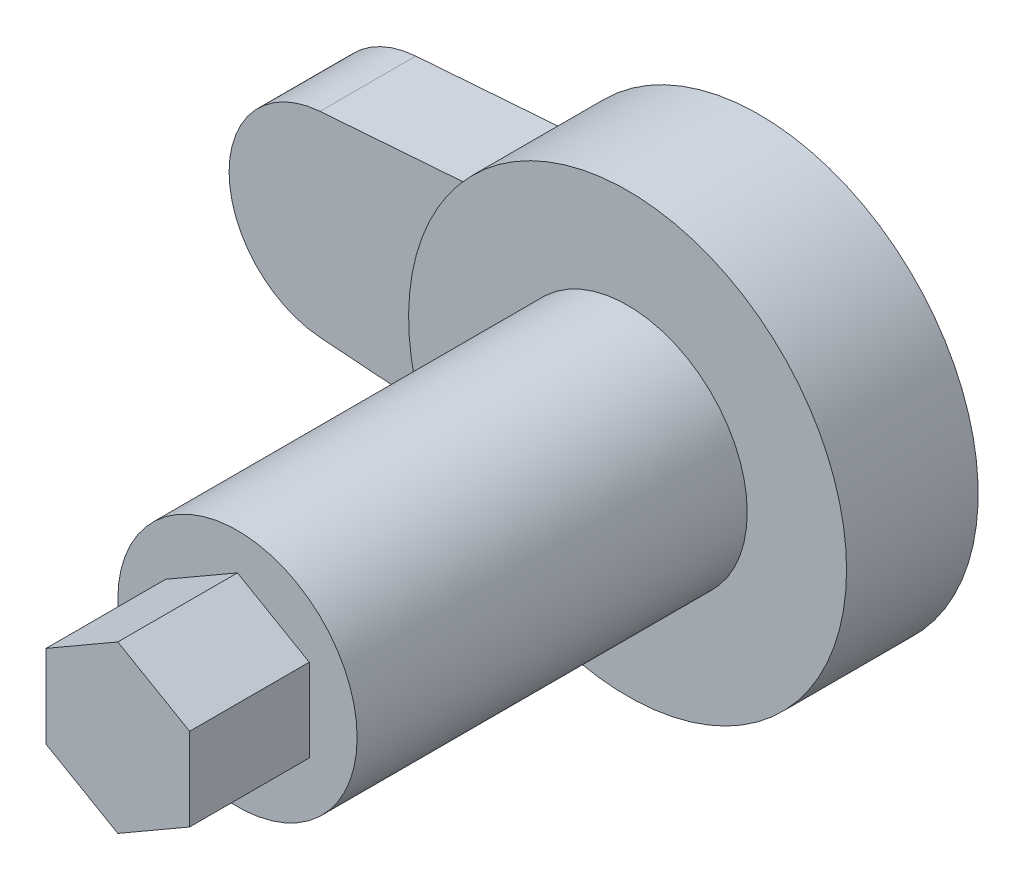
ISO-10303-21;
HEADER;
FILE_DESCRIPTION(('STEP AP214'),'2;1');
FILE_NAME('part.step','',(''),(''),'','','');
FILE_SCHEMA(('AUTOMOTIVE_DESIGN { 1 0 10303 214 1 1 1 1 }'));
ENDSEC;
DATA;
#1=APPLICATION_CONTEXT('core data for automotive mechanical design processes');
#2=APPLICATION_PROTOCOL_DEFINITION('international standard','automotive_design',2000,#1);
#3=PRODUCT_CONTEXT('',#1,'mechanical');
#4=PRODUCT('Part','Part','',(#3));
#5=PRODUCT_RELATED_PRODUCT_CATEGORY('part','',(#4));
#6=PRODUCT_DEFINITION_FORMATION('','',#4);
#7=PRODUCT_DEFINITION_CONTEXT('part definition',#1,'design');
#8=PRODUCT_DEFINITION('design','',#6,#7);
#9=PRODUCT_DEFINITION_SHAPE('','',#8);
#10=(LENGTH_UNIT() NAMED_UNIT(*) SI_UNIT(.MILLI.,.METRE.));
#11=(NAMED_UNIT(*) PLANE_ANGLE_UNIT() SI_UNIT($,.RADIAN.));
#12=(NAMED_UNIT(*) SI_UNIT($,.STERADIAN.) SOLID_ANGLE_UNIT());
#13=UNCERTAINTY_MEASURE_WITH_UNIT(LENGTH_MEASURE(1.E-05),#10,'distance_accuracy_value','');
#14=(GEOMETRIC_REPRESENTATION_CONTEXT(3) GLOBAL_UNCERTAINTY_ASSIGNED_CONTEXT((#13)) GLOBAL_UNIT_ASSIGNED_CONTEXT((#10,
#11,#12)) REPRESENTATION_CONTEXT('',''));
#15=CARTESIAN_POINT('',(0.,0.,0.));
#16=DIRECTION('',(0.,0.,1.));
#17=DIRECTION('',(1.,0.,0.));
#18=AXIS2_PLACEMENT_3D('',#15,#16,#17);
#19=CARTESIAN_POINT('',(-14.3508849968179,-4.08894463384991,4.));
#20=DIRECTION('',(0.0733865845897297,0.997303569231683,0.));
#21=DIRECTION('',(-0.997303569231683,0.0733865845897297,0.));
#22=AXIS2_PLACEMENT_3D('',#19,#20,#21);
#23=PLANE('',#22);
#24=DIRECTION('',(0.,0.,-1.));
#25=VECTOR('',#24,1.);
#26=CARTESIAN_POINT('',(-7.93204056601082,-4.56127531060928,5.5));
#27=LINE('',#26,#25);
#28=CARTESIAN_POINT('',(-7.93204056601082,-4.56127531060928,4.));
#29=VERTEX_POINT('',#28);
#30=CARTESIAN_POINT('',(-7.93204056601082,-4.56127531060928,0.));
#31=VERTEX_POINT('',#30);
#32=EDGE_CURVE('E205',#29,#31,#27,.T.);
#33=ORIENTED_EDGE('',*,*,#32,.F.);
#34=DIRECTION('',(0.997303569231683,-0.0733865845897297,0.));
#35=VECTOR('',#34,1.);
#36=CARTESIAN_POINT('',(-14.3508849968179,-4.08894463384991,4.));
#37=LINE('',#36,#35);
#38=CARTESIAN_POINT('',(-14.3508849968179,-4.08894463384991,4.));
#39=VERTEX_POINT('',#38);
#40=EDGE_CURVE('E211',#39,#29,#37,.T.);
#41=ORIENTED_EDGE('',*,*,#40,.F.);
#42=DIRECTION('',(0.,0.,-1.));
#43=VECTOR('',#42,1.);
#44=CARTESIAN_POINT('',(-14.3508849968179,-4.08894463384991,4.));
#45=LINE('',#44,#43);
#46=CARTESIAN_POINT('',(-14.3508849968179,-4.08894463384991,0.));
#47=VERTEX_POINT('',#46);
#48=EDGE_CURVE('E37',#39,#47,#45,.T.);
#49=ORIENTED_EDGE('',*,*,#48,.T.);
#50=DIRECTION('',(0.997303569231683,-0.0733865845897297,0.));
#51=VECTOR('',#50,1.);
#52=CARTESIAN_POINT('',(-14.3508849968179,-4.08894463384991,0.));
#53=LINE('',#52,#51);
#54=EDGE_CURVE('E220',#47,#31,#53,.T.);
#55=ORIENTED_EDGE('',*,*,#54,.T.);
#56=EDGE_LOOP('',(#33,#41,#49,#55));
#57=FACE_BOUND('',#56,.T.);
#58=ADVANCED_FACE('F33',(#57),#23,.F.);
#59=CARTESIAN_POINT('',(-2.4861507705218,4.9620111191163,4.));
#60=DIRECTION('',(0.0733865845897309,-0.997303569231683,0.));
#61=DIRECTION('',(0.997303569231683,0.0733865845897309,0.));
#62=AXIS2_PLACEMENT_3D('',#59,#60,#61);
#63=PLANE('',#62);
#64=DIRECTION('',(0.,0.,-1.));
#65=VECTOR('',#64,1.);
#66=CARTESIAN_POINT('',(-7.93204056601083,4.56127531060927,5.5));
#67=LINE('',#66,#65);
#68=CARTESIAN_POINT('',(-7.93204056601083,4.56127531060927,0.));
#69=VERTEX_POINT('',#68);
#70=CARTESIAN_POINT('',(-7.93204056601083,4.56127531060927,4.));
#71=VERTEX_POINT('',#70);
#72=EDGE_CURVE('E203',#69,#71,#67,.F.);
#73=ORIENTED_EDGE('',*,*,#72,.F.);
#74=DIRECTION('',(-0.997303569231683,-0.0733865845897309,0.));
#75=VECTOR('',#74,1.);
#76=CARTESIAN_POINT('',(-2.4861507705218,4.9620111191163,0.));
#77=LINE('',#76,#75);
#78=CARTESIAN_POINT('',(-14.3508849968179,4.08894463384989,0.));
#79=VERTEX_POINT('',#78);
#80=EDGE_CURVE('E212',#69,#79,#77,.T.);
#81=ORIENTED_EDGE('',*,*,#80,.T.);
#82=DIRECTION('',(0.,0.,-1.));
#83=VECTOR('',#82,1.);
#84=CARTESIAN_POINT('',(-14.3508849968179,4.08894463384989,4.));
#85=LINE('',#84,#83);
#86=CARTESIAN_POINT('',(-14.3508849968179,4.08894463384989,4.));
#87=VERTEX_POINT('',#86);
#88=EDGE_CURVE('E217',#87,#79,#85,.T.);
#89=ORIENTED_EDGE('',*,*,#88,.F.);
#90=DIRECTION('',(-0.997303569231683,-0.0733865845897309,0.));
#91=VECTOR('',#90,1.);
#92=CARTESIAN_POINT('',(-2.4861507705218,4.9620111191163,4.));
#93=LINE('',#92,#91);
#94=EDGE_CURVE('E215',#71,#87,#93,.T.);
#95=ORIENTED_EDGE('',*,*,#94,.F.);
#96=EDGE_LOOP('',(#73,#81,#89,#95));
#97=FACE_BOUND('',#96,.T.);
#98=ADVANCED_FACE('F241',(#97),#63,.F.);
#99=CARTESIAN_POINT('',(-14.05,0.,4.));
#100=DIRECTION('',(0.,0.,-1.));
#101=DIRECTION('',(-1.,0.,0.));
#102=AXIS2_PLACEMENT_3D('',#99,#100,#101);
#103=CYLINDRICAL_SURFACE('',#102,4.1);
#104=CARTESIAN_POINT('',(-14.05,0.,0.));
#105=DIRECTION('',(0.,0.,1.));
#106=DIRECTION('',(1.,0.,0.));
#107=AXIS2_PLACEMENT_3D('',#104,#105,#106);
#108=CIRCLE('',#107,4.1);
#109=EDGE_CURVE('E207',#79,#47,#108,.T.);
#110=ORIENTED_EDGE('',*,*,#109,.T.);
#111=ORIENTED_EDGE('',*,*,#48,.F.);
#112=CARTESIAN_POINT('',(-14.05,0.,4.));
#113=DIRECTION('',(0.,0.,1.));
#114=DIRECTION('',(1.,0.,0.));
#115=AXIS2_PLACEMENT_3D('',#112,#113,#114);
#116=CIRCLE('',#115,4.1);
#117=EDGE_CURVE('E208',#87,#39,#116,.T.);
#118=ORIENTED_EDGE('',*,*,#117,.F.);
#119=ORIENTED_EDGE('',*,*,#88,.T.);
#120=EDGE_LOOP('',(#110,#111,#118,#119));
#121=FACE_BOUND('',#120,.T.);
#122=ADVANCED_FACE('F35',(#121),#103,.T.);
#123=CARTESIAN_POINT('',(-14.05,0.,4.));
#124=DIRECTION('',(0.,0.,1.));
#125=DIRECTION('',(1.,0.,0.));
#126=AXIS2_PLACEMENT_3D('',#123,#124,#125);
#127=PLANE('',#126);
#128=ORIENTED_EDGE('',*,*,#40,.T.);
#129=CARTESIAN_POINT('',(0.,0.,4.));
#130=DIRECTION('',(0.,0.,1.));
#131=DIRECTION('',(1.,0.,0.));
#132=AXIS2_PLACEMENT_3D('',#129,#130,#131);
#133=CIRCLE('',#132,9.15000000000082);
#134=EDGE_CURVE('E199',#29,#71,#133,.F.);
#135=ORIENTED_EDGE('',*,*,#134,.T.);
#136=ORIENTED_EDGE('',*,*,#94,.T.);
#137=ORIENTED_EDGE('',*,*,#117,.T.);
#138=EDGE_LOOP('',(#128,#135,#136,#137));
#139=FACE_BOUND('',#138,.T.);
#140=ADVANCED_FACE('F243',(#139),#127,.T.);
#141=CARTESIAN_POINT('',(-14.05,0.,0.));
#142=DIRECTION('',(0.,0.,1.));
#143=DIRECTION('',(1.,0.,0.));
#144=AXIS2_PLACEMENT_3D('',#141,#142,#143);
#145=PLANE('',#144);
#146=DIRECTION('',(0.997303569231683,0.0733865845897309,0.));
#147=VECTOR('',#146,1.);
#148=CARTESIAN_POINT('',(-14.2041118276384,2.09433749538652,0.));
#149=LINE('',#148,#147);
#150=CARTESIAN_POINT('',(-14.2041118276384,2.09433749538652,0.));
#151=VERTEX_POINT('',#150);
#152=CARTESIAN_POINT('',(-1.89823831119252,2.99986521595902,0.));
#153=VERTEX_POINT('',#152);
#154=EDGE_CURVE('E179',#151,#153,#149,.T.);
#155=ORIENTED_EDGE('',*,*,#154,.F.);
#156=CARTESIAN_POINT('',(-14.05,0.,0.));
#157=DIRECTION('',(0.,0.,-1.));
#158=DIRECTION('',(-1.,0.,0.));
#159=AXIS2_PLACEMENT_3D('',#156,#157,#158);
#160=CIRCLE('',#159,2.1);
#161=CARTESIAN_POINT('',(-14.2041118276384,-2.09433749538654,0.));
#162=VERTEX_POINT('',#161);
#163=EDGE_CURVE('E158',#162,#151,#160,.T.);
#164=ORIENTED_EDGE('',*,*,#163,.F.);
#165=DIRECTION('',(-0.997303569231683,0.0733865845897298,0.));
#166=VECTOR('',#165,1.);
#167=CARTESIAN_POINT('',(-1.89823831119252,-2.99986521595903,0.));
#168=LINE('',#167,#166);
#169=CARTESIAN_POINT('',(-1.89823831119252,-2.99986521595903,0.));
#170=VERTEX_POINT('',#169);
#171=EDGE_CURVE('E168',#170,#162,#168,.T.);
#172=ORIENTED_EDGE('',*,*,#171,.F.);
#173=CARTESIAN_POINT('',(0.,0.,0.));
#174=DIRECTION('',(0.,0.,-1.));
#175=DIRECTION('',(-1.,0.,0.));
#176=AXIS2_PLACEMENT_3D('',#173,#174,#175);
#177=CIRCLE('',#176,3.55);
#178=EDGE_CURVE('E182',#153,#170,#177,.T.);
#179=ORIENTED_EDGE('',*,*,#178,.F.);
#180=EDGE_LOOP('',(#155,#164,#172,#179));
#181=FACE_BOUND('',#180,.T.);
#182=ORIENTED_EDGE('',*,*,#80,.F.);
#183=CARTESIAN_POINT('',(0.,0.,0.));
#184=DIRECTION('',(0.,0.,1.));
#185=DIRECTION('',(1.,0.,0.));
#186=AXIS2_PLACEMENT_3D('',#183,#184,#185);
#187=CIRCLE('',#186,9.15000000000082);
#188=EDGE_CURVE('E189',#31,#69,#187,.T.);
#189=ORIENTED_EDGE('',*,*,#188,.F.);
#190=ORIENTED_EDGE('',*,*,#54,.F.);
#191=ORIENTED_EDGE('',*,*,#109,.F.);
#192=EDGE_LOOP('',(#182,#189,#190,#191));
#193=FACE_BOUND('',#192,.T.);
#194=ADVANCED_FACE('F234',(#181,#193),#145,.F.);
#195=CARTESIAN_POINT('',(0.,0.,5.5));
#196=DIRECTION('',(0.,0.,-1.));
#197=DIRECTION('',(-1.,0.,0.));
#198=AXIS2_PLACEMENT_3D('',#195,#196,#197);
#199=CYLINDRICAL_SURFACE('',#198,9.15000000000082);
#200=CARTESIAN_POINT('',(0.,0.,5.5));
#201=DIRECTION('',(0.,0.,1.));
#202=DIRECTION('',(1.,0.,0.));
#203=AXIS2_PLACEMENT_3D('',#200,#201,#202);
#204=CIRCLE('',#203,9.15000000000082);
#205=CARTESIAN_POINT('',(9.15000000000082,0.,5.5));
#206=VERTEX_POINT('',#205);
#207=EDGE_CURVE('E196',#206,#206,#204,.T.);
#208=ORIENTED_EDGE('',*,*,#207,.F.);
#209=EDGE_LOOP('',(#208));
#210=FACE_BOUND('',#209,.T.);
#211=ORIENTED_EDGE('',*,*,#134,.F.);
#212=ORIENTED_EDGE('',*,*,#32,.T.);
#213=ORIENTED_EDGE('',*,*,#188,.T.);
#214=ORIENTED_EDGE('',*,*,#72,.T.);
#215=EDGE_LOOP('',(#211,#212,#213,#214));
#216=FACE_BOUND('',#215,.T.);
#217=ADVANCED_FACE('F238',(#210,#216),#199,.T.);
#218=CARTESIAN_POINT('',(0.,0.,5.5));
#219=DIRECTION('',(0.,0.,1.));
#220=DIRECTION('',(1.,0.,0.));
#221=AXIS2_PLACEMENT_3D('',#218,#219,#220);
#222=PLANE('',#221);
#223=CARTESIAN_POINT('',(0.,0.,5.5));
#224=DIRECTION('',(0.,0.,1.));
#225=DIRECTION('',(1.,0.,0.));
#226=AXIS2_PLACEMENT_3D('',#223,#224,#225);
#227=CIRCLE('',#226,5.);
#228=CARTESIAN_POINT('',(5.00000000000002,0.,5.5));
#229=VERTEX_POINT('',#228);
#230=EDGE_CURVE('E11',#229,#229,#227,.T.);
#231=ORIENTED_EDGE('',*,*,#230,.F.);
#232=EDGE_LOOP('',(#231));
#233=FACE_BOUND('',#232,.T.);
#234=ORIENTED_EDGE('',*,*,#207,.T.);
#235=EDGE_LOOP('',(#234));
#236=FACE_BOUND('',#235,.T.);
#237=ADVANCED_FACE('F290',(#233,#236),#222,.T.);
#238=CARTESIAN_POINT('',(-14.05,0.,3.));
#239=DIRECTION('',(0.,0.,-1.));
#240=DIRECTION('',(-1.,0.,0.));
#241=AXIS2_PLACEMENT_3D('',#238,#239,#240);
#242=CYLINDRICAL_SURFACE('',#241,2.1);
#243=ORIENTED_EDGE('',*,*,#163,.T.);
#244=DIRECTION('',(0.,0.,-1.));
#245=VECTOR('',#244,1.);
#246=CARTESIAN_POINT('',(-14.2041118276384,2.09433749538652,3.));
#247=LINE('',#246,#245);
#248=CARTESIAN_POINT('',(-14.2041118276384,2.09433749538652,3.));
#249=VERTEX_POINT('',#248);
#250=EDGE_CURVE('E177',#249,#151,#247,.T.);
#251=ORIENTED_EDGE('',*,*,#250,.F.);
#252=CARTESIAN_POINT('',(-14.05,0.,3.));
#253=DIRECTION('',(0.,0.,-1.));
#254=DIRECTION('',(-1.,0.,0.));
#255=AXIS2_PLACEMENT_3D('',#252,#253,#254);
#256=CIRCLE('',#255,2.1);
#257=CARTESIAN_POINT('',(-14.2041118276384,-2.09433749538654,3.));
#258=VERTEX_POINT('',#257);
#259=EDGE_CURVE('E164',#258,#249,#256,.T.);
#260=ORIENTED_EDGE('',*,*,#259,.F.);
#261=DIRECTION('',(0.,0.,-1.));
#262=VECTOR('',#261,1.);
#263=CARTESIAN_POINT('',(-14.2041118276384,-2.09433749538654,3.));
#264=LINE('',#263,#262);
#265=EDGE_CURVE('E187',#258,#162,#264,.T.);
#266=ORIENTED_EDGE('',*,*,#265,.T.);
#267=EDGE_LOOP('',(#243,#251,#260,#266));
#268=FACE_BOUND('',#267,.T.);
#269=ADVANCED_FACE('F298',(#268),#242,.F.);
#270=CARTESIAN_POINT('',(-1.89823831119252,-2.99986521595903,3.));
#271=DIRECTION('',(-0.0733865845897298,-0.997303569231683,0.));
#272=DIRECTION('',(0.997303569231683,-0.0733865845897298,0.));
#273=AXIS2_PLACEMENT_3D('',#270,#271,#272);
#274=PLANE('',#273);
#275=ORIENTED_EDGE('',*,*,#171,.T.);
#276=ORIENTED_EDGE('',*,*,#265,.F.);
#277=DIRECTION('',(-0.997303569231683,0.0733865845897298,0.));
#278=VECTOR('',#277,1.);
#279=CARTESIAN_POINT('',(-1.89823831119252,-2.99986521595903,3.));
#280=LINE('',#279,#278);
#281=CARTESIAN_POINT('',(-1.89823831119252,-2.99986521595903,3.));
#282=VERTEX_POINT('',#281);
#283=EDGE_CURVE('E174',#282,#258,#280,.T.);
#284=ORIENTED_EDGE('',*,*,#283,.F.);
#285=DIRECTION('',(0.,0.,-1.));
#286=VECTOR('',#285,1.);
#287=CARTESIAN_POINT('',(-1.89823831119252,-2.99986521595903,3.));
#288=LINE('',#287,#286);
#289=EDGE_CURVE('E190',#282,#170,#288,.T.);
#290=ORIENTED_EDGE('',*,*,#289,.T.);
#291=EDGE_LOOP('',(#275,#276,#284,#290));
#292=FACE_BOUND('',#291,.T.);
#293=ADVANCED_FACE('F308',(#292),#274,.F.);
#294=CARTESIAN_POINT('',(0.,0.,3.));
#295=DIRECTION('',(0.,0.,-1.));
#296=DIRECTION('',(-1.,0.,0.));
#297=AXIS2_PLACEMENT_3D('',#294,#295,#296);
#298=CYLINDRICAL_SURFACE('',#297,3.55);
#299=ORIENTED_EDGE('',*,*,#178,.T.);
#300=ORIENTED_EDGE('',*,*,#289,.F.);
#301=CARTESIAN_POINT('',(0.,0.,3.));
#302=DIRECTION('',(0.,0.,-1.));
#303=DIRECTION('',(-1.,0.,0.));
#304=AXIS2_PLACEMENT_3D('',#301,#302,#303);
#305=CIRCLE('',#304,3.55);
#306=CARTESIAN_POINT('',(-1.89823831119252,2.99986521595902,3.));
#307=VERTEX_POINT('',#306);
#308=EDGE_CURVE('E171',#307,#282,#305,.T.);
#309=ORIENTED_EDGE('',*,*,#308,.F.);
#310=DIRECTION('',(0.,0.,-1.));
#311=VECTOR('',#310,1.);
#312=CARTESIAN_POINT('',(-1.89823831119252,2.99986521595902,3.));
#313=LINE('',#312,#311);
#314=EDGE_CURVE('E192',#307,#153,#313,.T.);
#315=ORIENTED_EDGE('',*,*,#314,.T.);
#316=EDGE_LOOP('',(#299,#300,#309,#315));
#317=FACE_BOUND('',#316,.T.);
#318=ADVANCED_FACE('F317',(#317),#298,.F.);
#319=CARTESIAN_POINT('',(-14.2041118276384,2.09433749538652,3.));
#320=DIRECTION('',(-0.0733865845897309,0.997303569231683,0.));
#321=DIRECTION('',(-0.997303569231683,-0.0733865845897309,0.));
#322=AXIS2_PLACEMENT_3D('',#319,#320,#321);
#323=PLANE('',#322);
#324=ORIENTED_EDGE('',*,*,#154,.T.);
#325=ORIENTED_EDGE('',*,*,#314,.F.);
#326=DIRECTION('',(0.997303569231683,0.0733865845897309,0.));
#327=VECTOR('',#326,1.);
#328=CARTESIAN_POINT('',(-14.2041118276384,2.09433749538652,3.));
#329=LINE('',#328,#327);
#330=EDGE_CURVE('E167',#249,#307,#329,.T.);
#331=ORIENTED_EDGE('',*,*,#330,.F.);
#332=ORIENTED_EDGE('',*,*,#250,.T.);
#333=EDGE_LOOP('',(#324,#325,#331,#332));
#334=FACE_BOUND('',#333,.T.);
#335=ADVANCED_FACE('F326',(#334),#323,.F.);
#336=CARTESIAN_POINT('',(-14.05,0.,3.));
#337=DIRECTION('',(0.,0.,-1.));
#338=DIRECTION('',(-1.,0.,0.));
#339=AXIS2_PLACEMENT_3D('',#336,#337,#338);
#340=PLANE('',#339);
#341=ORIENTED_EDGE('',*,*,#259,.T.);
#342=ORIENTED_EDGE('',*,*,#330,.T.);
#343=ORIENTED_EDGE('',*,*,#308,.T.);
#344=ORIENTED_EDGE('',*,*,#283,.T.);
#345=EDGE_LOOP('',(#341,#342,#343,#344));
#346=FACE_BOUND('',#345,.T.);
#347=ADVANCED_FACE('F335',(#346),#340,.T.);
#348=CARTESIAN_POINT('',(0.,0.,21.8));
#349=DIRECTION('',(0.,0.,-1.));
#350=DIRECTION('',(-1.,0.,0.));
#351=AXIS2_PLACEMENT_3D('',#348,#349,#350);
#352=CYLINDRICAL_SURFACE('',#351,5.);
#353=CARTESIAN_POINT('',(0.,0.,21.8));
#354=DIRECTION('',(0.,0.,1.));
#355=DIRECTION('',(1.,0.,0.));
#356=AXIS2_PLACEMENT_3D('',#353,#354,#355);
#357=CIRCLE('',#356,5.);
#358=CARTESIAN_POINT('',(5.00000000000002,0.,21.8));
#359=VERTEX_POINT('',#358);
#360=EDGE_CURVE('E155',#359,#359,#357,.T.);
#361=ORIENTED_EDGE('',*,*,#360,.F.);
#362=EDGE_LOOP('',(#361));
#363=FACE_BOUND('',#362,.T.);
#364=ORIENTED_EDGE('',*,*,#230,.T.);
#365=EDGE_LOOP('',(#364));
#366=FACE_BOUND('',#365,.T.);
#367=ADVANCED_FACE('F343',(#363,#366),#352,.T.);
#368=CARTESIAN_POINT('',(0.,0.,21.8));
#369=DIRECTION('',(0.,0.,1.));
#370=DIRECTION('',(1.,0.,0.));
#371=AXIS2_PLACEMENT_3D('',#368,#369,#370);
#372=PLANE('',#371);
#373=DIRECTION('',(-0.866025403784439,0.5,0.));
#374=VECTOR('',#373,1.);
#375=CARTESIAN_POINT('',(3.00000000000002,1.73205080756887,21.8));
#376=LINE('',#375,#374);
#377=CARTESIAN_POINT('',(3.00000000000002,1.73205080756887,21.8));
#378=VERTEX_POINT('',#377);
#379=CARTESIAN_POINT('',(0.,3.46410161513775,21.8));
#380=VERTEX_POINT('',#379);
#381=EDGE_CURVE('E49',#378,#380,#376,.T.);
#382=ORIENTED_EDGE('',*,*,#381,.F.);
#383=DIRECTION('',(0.,1.,0.));
#384=VECTOR('',#383,1.);
#385=CARTESIAN_POINT('',(3.00000000000002,-1.73205080756888,21.8));
#386=LINE('',#385,#384);
#387=CARTESIAN_POINT('',(3.00000000000002,-1.73205080756888,21.8));
#388=VERTEX_POINT('',#387);
#389=EDGE_CURVE('E53',#388,#378,#386,.T.);
#390=ORIENTED_EDGE('',*,*,#389,.F.);
#391=DIRECTION('',(0.866025403784439,0.5,0.));
#392=VECTOR('',#391,1.);
#393=CARTESIAN_POINT('',(0.,-3.46410161513776,21.8));
#394=LINE('',#393,#392);
#395=CARTESIAN_POINT('',(0.,-3.46410161513776,21.8));
#396=VERTEX_POINT('',#395);
#397=EDGE_CURVE('E439',#396,#388,#394,.T.);
#398=ORIENTED_EDGE('',*,*,#397,.F.);
#399=DIRECTION('',(0.866025403784439,-0.5,0.));
#400=VECTOR('',#399,1.);
#401=CARTESIAN_POINT('',(-2.99999999999998,-1.73205080756888,21.8));
#402=LINE('',#401,#400);
#403=CARTESIAN_POINT('',(-2.99999999999998,-1.73205080756888,21.8));
#404=VERTEX_POINT('',#403);
#405=EDGE_CURVE('E454',#404,#396,#402,.T.);
#406=ORIENTED_EDGE('',*,*,#405,.F.);
#407=DIRECTION('',(0.,-1.,0.));
#408=VECTOR('',#407,1.);
#409=CARTESIAN_POINT('',(-2.99999999999998,1.73205080756887,21.8));
#410=LINE('',#409,#408);
#411=CARTESIAN_POINT('',(-2.99999999999998,1.73205080756887,21.8));
#412=VERTEX_POINT('',#411);
#413=EDGE_CURVE('E457',#412,#404,#410,.T.);
#414=ORIENTED_EDGE('',*,*,#413,.F.);
#415=DIRECTION('',(-0.866025403784439,-0.5,0.));
#416=VECTOR('',#415,1.);
#417=CARTESIAN_POINT('',(0.,3.46410161513775,21.8));
#418=LINE('',#417,#416);
#419=EDGE_CURVE('E458',#380,#412,#418,.T.);
#420=ORIENTED_EDGE('',*,*,#419,.F.);
#421=EDGE_LOOP('',(#382,#390,#398,#406,#414,#420));
#422=FACE_BOUND('',#421,.T.);
#423=ORIENTED_EDGE('',*,*,#360,.T.);
#424=EDGE_LOOP('',(#423));
#425=FACE_BOUND('',#424,.T.);
#426=ADVANCED_FACE('F351',(#422,#425),#372,.T.);
#427=CARTESIAN_POINT('',(3.00000000000002,1.73205080756887,26.8));
#428=DIRECTION('',(-0.5,-0.866025403784439,0.));
#429=DIRECTION('',(0.866025403784439,-0.5,0.));
#430=AXIS2_PLACEMENT_3D('',#427,#428,#429);
#431=PLANE('',#430);
#432=ORIENTED_EDGE('',*,*,#381,.T.);
#433=DIRECTION('',(0.,0.,-1.));
#434=VECTOR('',#433,1.);
#435=CARTESIAN_POINT('',(0.,3.46410161513775,26.8));
#436=LINE('',#435,#434);
#437=CARTESIAN_POINT('',(0.,3.46410161513775,26.8));
#438=VERTEX_POINT('',#437);
#439=EDGE_CURVE('E138',#438,#380,#436,.T.);
#440=ORIENTED_EDGE('',*,*,#439,.F.);
#441=DIRECTION('',(-0.866025403784439,0.5,0.));
#442=VECTOR('',#441,1.);
#443=CARTESIAN_POINT('',(3.00000000000002,1.73205080756887,26.8));
#444=LINE('',#443,#442);
#445=CARTESIAN_POINT('',(3.00000000000002,1.73205080756887,26.8));
#446=VERTEX_POINT('',#445);
#447=EDGE_CURVE('E144',#446,#438,#444,.T.);
#448=ORIENTED_EDGE('',*,*,#447,.F.);
#449=DIRECTION('',(0.,0.,-1.));
#450=VECTOR('',#449,1.);
#451=CARTESIAN_POINT('',(3.00000000000002,1.73205080756887,26.8));
#452=LINE('',#451,#450);
#453=EDGE_CURVE('E436',#446,#378,#452,.T.);
#454=ORIENTED_EDGE('',*,*,#453,.T.);
#455=EDGE_LOOP('',(#432,#440,#448,#454));
#456=FACE_BOUND('',#455,.T.);
#457=ADVANCED_FACE('F154',(#456),#431,.F.);
#458=CARTESIAN_POINT('',(0.,3.46410161513775,26.8));
#459=DIRECTION('',(0.5,-0.866025403784439,0.));
#460=DIRECTION('',(0.866025403784439,0.5,0.));
#461=AXIS2_PLACEMENT_3D('',#458,#459,#460);
#462=PLANE('',#461);
#463=ORIENTED_EDGE('',*,*,#419,.T.);
#464=DIRECTION('',(0.,0.,-1.));
#465=VECTOR('',#464,1.);
#466=CARTESIAN_POINT('',(-2.99999999999998,1.73205080756887,26.8));
#467=LINE('',#466,#465);
#468=CARTESIAN_POINT('',(-2.99999999999998,1.73205080756887,26.8));
#469=VERTEX_POINT('',#468);
#470=EDGE_CURVE('E140',#469,#412,#467,.T.);
#471=ORIENTED_EDGE('',*,*,#470,.F.);
#472=DIRECTION('',(-0.866025403784439,-0.5,0.));
#473=VECTOR('',#472,1.);
#474=CARTESIAN_POINT('',(0.,3.46410161513775,26.8));
#475=LINE('',#474,#473);
#476=EDGE_CURVE('E133',#438,#469,#475,.T.);
#477=ORIENTED_EDGE('',*,*,#476,.F.);
#478=ORIENTED_EDGE('',*,*,#439,.T.);
#479=EDGE_LOOP('',(#463,#471,#477,#478));
#480=FACE_BOUND('',#479,.T.);
#481=ADVANCED_FACE('F136',(#480),#462,.F.);
#482=CARTESIAN_POINT('',(-2.99999999999998,1.73205080756887,26.8));
#483=DIRECTION('',(1.,0.,0.));
#484=DIRECTION('',(0.,1.,0.));
#485=AXIS2_PLACEMENT_3D('',#482,#483,#484);
#486=PLANE('',#485);
#487=ORIENTED_EDGE('',*,*,#413,.T.);
#488=DIRECTION('',(0.,0.,-1.));
#489=VECTOR('',#488,1.);
#490=CARTESIAN_POINT('',(-2.99999999999998,-1.73205080756888,26.8));
#491=LINE('',#490,#489);
#492=CARTESIAN_POINT('',(-2.99999999999998,-1.73205080756888,26.8));
#493=VERTEX_POINT('',#492);
#494=EDGE_CURVE('E160',#493,#404,#491,.T.);
#495=ORIENTED_EDGE('',*,*,#494,.F.);
#496=DIRECTION('',(0.,-1.,0.));
#497=VECTOR('',#496,1.);
#498=CARTESIAN_POINT('',(-2.99999999999998,1.73205080756887,26.8));
#499=LINE('',#498,#497);
#500=EDGE_CURVE('E143',#469,#493,#499,.T.);
#501=ORIENTED_EDGE('',*,*,#500,.F.);
#502=ORIENTED_EDGE('',*,*,#470,.T.);
#503=EDGE_LOOP('',(#487,#495,#501,#502));
#504=FACE_BOUND('',#503,.T.);
#505=ADVANCED_FACE('F374',(#504),#486,.F.);
#506=CARTESIAN_POINT('',(-2.99999999999998,-1.73205080756888,26.8));
#507=DIRECTION('',(0.5,0.866025403784439,0.));
#508=DIRECTION('',(-0.866025403784439,0.5,0.));
#509=AXIS2_PLACEMENT_3D('',#506,#507,#508);
#510=PLANE('',#509);
#511=ORIENTED_EDGE('',*,*,#405,.T.);
#512=DIRECTION('',(0.,0.,-1.));
#513=VECTOR('',#512,1.);
#514=CARTESIAN_POINT('',(0.,-3.46410161513776,26.8));
#515=LINE('',#514,#513);
#516=CARTESIAN_POINT('',(0.,-3.46410161513776,26.8));
#517=VERTEX_POINT('',#516);
#518=EDGE_CURVE('E442',#517,#396,#515,.T.);
#519=ORIENTED_EDGE('',*,*,#518,.F.);
#520=DIRECTION('',(0.866025403784439,-0.5,0.));
#521=VECTOR('',#520,1.);
#522=CARTESIAN_POINT('',(-2.99999999999998,-1.73205080756888,26.8));
#523=LINE('',#522,#521);
#524=EDGE_CURVE('E455',#493,#517,#523,.T.);
#525=ORIENTED_EDGE('',*,*,#524,.F.);
#526=ORIENTED_EDGE('',*,*,#494,.T.);
#527=EDGE_LOOP('',(#511,#519,#525,#526));
#528=FACE_BOUND('',#527,.T.);
#529=ADVANCED_FACE('F382',(#528),#510,.F.);
#530=CARTESIAN_POINT('',(0.,-3.46410161513776,26.8));
#531=DIRECTION('',(-0.5,0.866025403784439,0.));
#532=DIRECTION('',(-0.866025403784439,-0.5,0.));
#533=AXIS2_PLACEMENT_3D('',#530,#531,#532);
#534=PLANE('',#533);
#535=ORIENTED_EDGE('',*,*,#397,.T.);
#536=DIRECTION('',(0.,0.,-1.));
#537=VECTOR('',#536,1.);
#538=CARTESIAN_POINT('',(3.00000000000002,-1.73205080756888,26.8));
#539=LINE('',#538,#537);
#540=CARTESIAN_POINT('',(3.00000000000002,-1.73205080756888,26.8));
#541=VERTEX_POINT('',#540);
#542=EDGE_CURVE('E438',#541,#388,#539,.T.);
#543=ORIENTED_EDGE('',*,*,#542,.F.);
#544=DIRECTION('',(0.866025403784439,0.5,0.));
#545=VECTOR('',#544,1.);
#546=CARTESIAN_POINT('',(0.,-3.46410161513776,26.8));
#547=LINE('',#546,#545);
#548=EDGE_CURVE('E444',#517,#541,#547,.T.);
#549=ORIENTED_EDGE('',*,*,#548,.F.);
#550=ORIENTED_EDGE('',*,*,#518,.T.);
#551=EDGE_LOOP('',(#535,#543,#549,#550));
#552=FACE_BOUND('',#551,.T.);
#553=ADVANCED_FACE('F391',(#552),#534,.F.);
#554=CARTESIAN_POINT('',(3.00000000000002,-1.73205080756888,26.8));
#555=DIRECTION('',(-1.,0.,0.));
#556=DIRECTION('',(0.,0.,1.));
#557=AXIS2_PLACEMENT_3D('',#554,#555,#556);
#558=PLANE('',#557);
#559=ORIENTED_EDGE('',*,*,#389,.T.);
#560=ORIENTED_EDGE('',*,*,#453,.F.);
#561=DIRECTION('',(0.,1.,0.));
#562=VECTOR('',#561,1.);
#563=CARTESIAN_POINT('',(3.00000000000002,-1.73205080756888,26.8));
#564=LINE('',#563,#562);
#565=EDGE_CURVE('E149',#541,#446,#564,.T.);
#566=ORIENTED_EDGE('',*,*,#565,.F.);
#567=ORIENTED_EDGE('',*,*,#542,.T.);
#568=EDGE_LOOP('',(#559,#560,#566,#567));
#569=FACE_BOUND('',#568,.T.);
#570=ADVANCED_FACE('F400',(#569),#558,.F.);
#571=CARTESIAN_POINT('',(0.,0.,26.8));
#572=DIRECTION('',(0.,0.,1.));
#573=DIRECTION('',(1.,0.,0.));
#574=AXIS2_PLACEMENT_3D('',#571,#572,#573);
#575=PLANE('',#574);
#576=ORIENTED_EDGE('',*,*,#447,.T.);
#577=ORIENTED_EDGE('',*,*,#476,.T.);
#578=ORIENTED_EDGE('',*,*,#500,.T.);
#579=ORIENTED_EDGE('',*,*,#524,.T.);
#580=ORIENTED_EDGE('',*,*,#548,.T.);
#581=ORIENTED_EDGE('',*,*,#565,.T.);
#582=EDGE_LOOP('',(#576,#577,#578,#579,#580,#581));
#583=FACE_BOUND('',#582,.T.);
#584=ADVANCED_FACE('F147',(#583),#575,.T.);
#585=CLOSED_SHELL('',(#58,#98,#122,#140,#194,#217,#237,#269,#293,#318,#335,#347,#367,#426,#457,
#481,#505,#529,#553,#570,#584));
#586=MANIFOLD_SOLID_BREP('B2',#585);
#587=ADVANCED_BREP_SHAPE_REPRESENTATION('',(#18,#586),#14);
#588=SHAPE_DEFINITION_REPRESENTATION(#9,#587);
ENDSEC;
END-ISO-10303-21;
